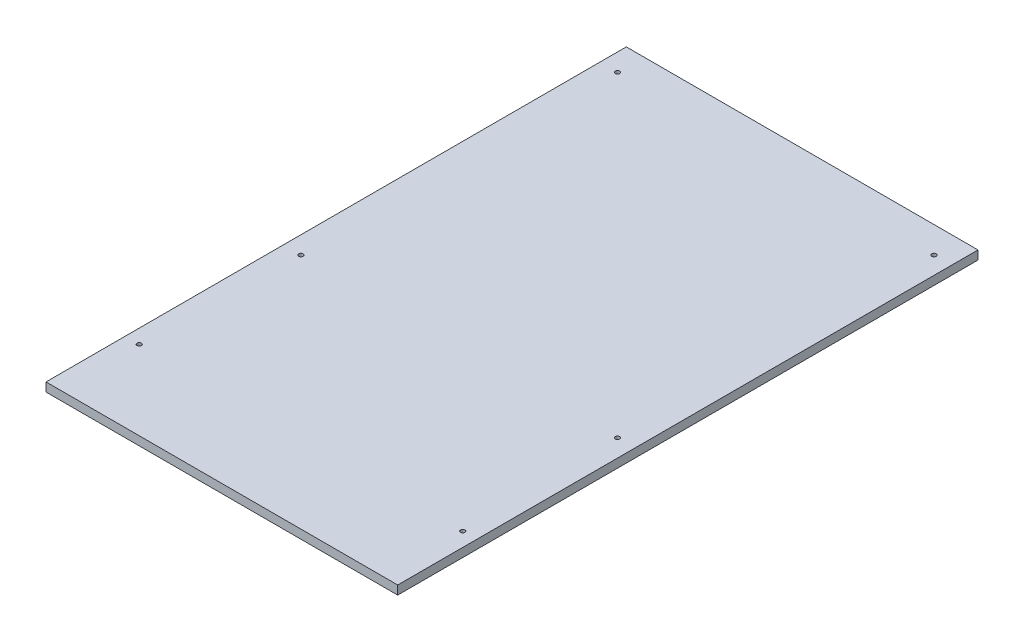
ISO-10303-21;
HEADER;
FILE_DESCRIPTION(('STEP AP214'),'2;1');
FILE_NAME('part.step','',(''),(''),'','','');
FILE_SCHEMA(('AUTOMOTIVE_DESIGN { 1 0 10303 214 1 1 1 1 }'));
ENDSEC;
DATA;
#1=APPLICATION_CONTEXT('core data for automotive mechanical design processes');
#2=APPLICATION_PROTOCOL_DEFINITION('international standard','automotive_design',2000,#1);
#3=PRODUCT_CONTEXT('',#1,'mechanical');
#4=PRODUCT('Part','Part','',(#3));
#5=PRODUCT_RELATED_PRODUCT_CATEGORY('part','',(#4));
#6=PRODUCT_DEFINITION_FORMATION('','',#4);
#7=PRODUCT_DEFINITION_CONTEXT('part definition',#1,'design');
#8=PRODUCT_DEFINITION('design','',#6,#7);
#9=PRODUCT_DEFINITION_SHAPE('','',#8);
#10=(LENGTH_UNIT() NAMED_UNIT(*) SI_UNIT(.MILLI.,.METRE.));
#11=(NAMED_UNIT(*) PLANE_ANGLE_UNIT() SI_UNIT($,.RADIAN.));
#12=(NAMED_UNIT(*) SI_UNIT($,.STERADIAN.) SOLID_ANGLE_UNIT());
#13=UNCERTAINTY_MEASURE_WITH_UNIT(LENGTH_MEASURE(1.E-05),#10,'distance_accuracy_value','');
#14=(GEOMETRIC_REPRESENTATION_CONTEXT(3) GLOBAL_UNCERTAINTY_ASSIGNED_CONTEXT((#13)) GLOBAL_UNIT_ASSIGNED_CONTEXT((#10,
#11,#12)) REPRESENTATION_CONTEXT('',''));
#15=CARTESIAN_POINT('',(0.,0.,0.));
#16=DIRECTION('',(0.,0.,1.));
#17=DIRECTION('',(1.,0.,0.));
#18=AXIS2_PLACEMENT_3D('',#15,#16,#17);
#19=CARTESIAN_POINT('',(-100.,5.,0.));
#20=DIRECTION('',(1.,0.,0.));
#21=DIRECTION('',(0.,0.,-1.));
#22=AXIS2_PLACEMENT_3D('',#19,#20,#21);
#23=PLANE('',#22);
#24=DIRECTION('',(0.,0.,1.));
#25=VECTOR('',#24,1.);
#26=CARTESIAN_POINT('',(-100.,0.,0.));
#27=LINE('',#26,#25);
#28=CARTESIAN_POINT('',(-100.,0.,-330.));
#29=VERTEX_POINT('',#28);
#30=CARTESIAN_POINT('',(-100.,0.,0.));
#31=VERTEX_POINT('',#30);
#32=EDGE_CURVE('E110',#29,#31,#27,.T.);
#33=ORIENTED_EDGE('',*,*,#32,.T.);
#34=DIRECTION('',(0.,-1.,0.));
#35=VECTOR('',#34,1.);
#36=CARTESIAN_POINT('',(-100.,5.,0.));
#37=LINE('',#36,#35);
#38=CARTESIAN_POINT('',(-100.,5.,0.));
#39=VERTEX_POINT('',#38);
#40=EDGE_CURVE('E11',#39,#31,#37,.T.);
#41=ORIENTED_EDGE('',*,*,#40,.F.);
#42=DIRECTION('',(0.,0.,1.));
#43=VECTOR('',#42,1.);
#44=CARTESIAN_POINT('',(-100.,5.,0.));
#45=LINE('',#44,#43);
#46=CARTESIAN_POINT('',(-100.,5.,-330.));
#47=VERTEX_POINT('',#46);
#48=EDGE_CURVE('E98',#47,#39,#45,.T.);
#49=ORIENTED_EDGE('',*,*,#48,.F.);
#50=DIRECTION('',(0.,-1.,0.));
#51=VECTOR('',#50,1.);
#52=CARTESIAN_POINT('',(-100.,5.,-330.));
#53=LINE('',#52,#51);
#54=EDGE_CURVE('E106',#47,#29,#53,.T.);
#55=ORIENTED_EDGE('',*,*,#54,.T.);
#56=EDGE_LOOP('',(#33,#41,#49,#55));
#57=FACE_BOUND('',#56,.T.);
#58=ADVANCED_FACE('F47',(#57),#23,.F.);
#59=CARTESIAN_POINT('',(-100.,5.,0.));
#60=DIRECTION('',(0.,0.,-1.));
#61=DIRECTION('',(-1.,0.,0.));
#62=AXIS2_PLACEMENT_3D('',#59,#60,#61);
#63=PLANE('',#62);
#64=DIRECTION('',(1.,0.,0.));
#65=VECTOR('',#64,1.);
#66=CARTESIAN_POINT('',(-100.,0.,0.));
#67=LINE('',#66,#65);
#68=CARTESIAN_POINT('',(100.,0.,0.));
#69=VERTEX_POINT('',#68);
#70=EDGE_CURVE('E102',#31,#69,#67,.T.);
#71=ORIENTED_EDGE('',*,*,#70,.T.);
#72=DIRECTION('',(0.,-1.,0.));
#73=VECTOR('',#72,1.);
#74=CARTESIAN_POINT('',(100.,5.,0.));
#75=LINE('',#74,#73);
#76=CARTESIAN_POINT('',(100.,5.,0.));
#77=VERTEX_POINT('',#76);
#78=EDGE_CURVE('E55',#77,#69,#75,.T.);
#79=ORIENTED_EDGE('',*,*,#78,.F.);
#80=DIRECTION('',(1.,0.,0.));
#81=VECTOR('',#80,1.);
#82=CARTESIAN_POINT('',(-100.,5.,0.));
#83=LINE('',#82,#81);
#84=EDGE_CURVE('E93',#39,#77,#83,.T.);
#85=ORIENTED_EDGE('',*,*,#84,.F.);
#86=ORIENTED_EDGE('',*,*,#40,.T.);
#87=EDGE_LOOP('',(#71,#79,#85,#86));
#88=FACE_BOUND('',#87,.T.);
#89=ADVANCED_FACE('F101',(#88),#63,.F.);
#90=CARTESIAN_POINT('',(100.,5.,0.));
#91=DIRECTION('',(-1.,0.,0.));
#92=DIRECTION('',(0.,0.,1.));
#93=AXIS2_PLACEMENT_3D('',#90,#91,#92);
#94=PLANE('',#93);
#95=DIRECTION('',(0.,0.,-1.));
#96=VECTOR('',#95,1.);
#97=CARTESIAN_POINT('',(100.,0.,0.));
#98=LINE('',#97,#96);
#99=CARTESIAN_POINT('',(100.,0.,-330.));
#100=VERTEX_POINT('',#99);
#101=EDGE_CURVE('E80',#69,#100,#98,.T.);
#102=ORIENTED_EDGE('',*,*,#101,.T.);
#103=DIRECTION('',(0.,-1.,0.));
#104=VECTOR('',#103,1.);
#105=CARTESIAN_POINT('',(100.,5.,-330.));
#106=LINE('',#105,#104);
#107=CARTESIAN_POINT('',(100.,5.,-330.));
#108=VERTEX_POINT('',#107);
#109=EDGE_CURVE('E103',#108,#100,#106,.T.);
#110=ORIENTED_EDGE('',*,*,#109,.F.);
#111=DIRECTION('',(0.,0.,-1.));
#112=VECTOR('',#111,1.);
#113=CARTESIAN_POINT('',(100.,5.,0.));
#114=LINE('',#113,#112);
#115=EDGE_CURVE('E96',#77,#108,#114,.T.);
#116=ORIENTED_EDGE('',*,*,#115,.F.);
#117=ORIENTED_EDGE('',*,*,#78,.T.);
#118=EDGE_LOOP('',(#102,#110,#116,#117));
#119=FACE_BOUND('',#118,.T.);
#120=ADVANCED_FACE('F104',(#119),#94,.F.);
#121=CARTESIAN_POINT('',(-100.,5.,-330.));
#122=DIRECTION('',(0.,0.,1.));
#123=DIRECTION('',(1.,0.,0.));
#124=AXIS2_PLACEMENT_3D('',#121,#122,#123);
#125=PLANE('',#124);
#126=DIRECTION('',(-1.,0.,0.));
#127=VECTOR('',#126,1.);
#128=CARTESIAN_POINT('',(-100.,0.,-330.));
#129=LINE('',#128,#127);
#130=EDGE_CURVE('E86',#100,#29,#129,.T.);
#131=ORIENTED_EDGE('',*,*,#130,.T.);
#132=ORIENTED_EDGE('',*,*,#54,.F.);
#133=DIRECTION('',(-1.,0.,0.));
#134=VECTOR('',#133,1.);
#135=CARTESIAN_POINT('',(-100.,5.,-330.));
#136=LINE('',#135,#134);
#137=EDGE_CURVE('E63',#108,#47,#136,.T.);
#138=ORIENTED_EDGE('',*,*,#137,.F.);
#139=ORIENTED_EDGE('',*,*,#109,.T.);
#140=EDGE_LOOP('',(#131,#132,#138,#139));
#141=FACE_BOUND('',#140,.T.);
#142=ADVANCED_FACE('F118',(#141),#125,.F.);
#143=CARTESIAN_POINT('',(0.,5.,0.));
#144=DIRECTION('',(0.,-1.,0.));
#145=DIRECTION('',(0.,0.,-1.));
#146=AXIS2_PLACEMENT_3D('',#143,#144,#145);
#147=PLANE('',#146);
#148=CARTESIAN_POINT('',(-92.,5.,-45.));
#149=DIRECTION('',(0.,1.,0.));
#150=DIRECTION('',(0.,0.,1.));
#151=AXIS2_PLACEMENT_3D('',#148,#149,#150);
#152=CIRCLE('',#151,1.25);
#153=CARTESIAN_POINT('',(-92.,5.,-43.75));
#154=VERTEX_POINT('',#153);
#155=EDGE_CURVE('E156',#154,#154,#152,.T.);
#156=ORIENTED_EDGE('',*,*,#155,.F.);
#157=EDGE_LOOP('',(#156));
#158=FACE_BOUND('',#157,.T.);
#159=CARTESIAN_POINT('',(92.,5.,-45.));
#160=DIRECTION('',(0.,1.,0.));
#161=DIRECTION('',(0.,0.,1.));
#162=AXIS2_PLACEMENT_3D('',#159,#160,#161);
#163=CIRCLE('',#162,1.25);
#164=CARTESIAN_POINT('',(92.,5.,-43.75));
#165=VERTEX_POINT('',#164);
#166=EDGE_CURVE('E150',#165,#165,#163,.T.);
#167=ORIENTED_EDGE('',*,*,#166,.F.);
#168=EDGE_LOOP('',(#167));
#169=FACE_BOUND('',#168,.T.);
#170=CARTESIAN_POINT('',(-90.,5.,-134.977775033616));
#171=DIRECTION('',(0.,1.,0.));
#172=DIRECTION('',(0.,0.,1.));
#173=AXIS2_PLACEMENT_3D('',#170,#171,#172);
#174=CIRCLE('',#173,1.25);
#175=CARTESIAN_POINT('',(-90.,5.,-133.727775033616));
#176=VERTEX_POINT('',#175);
#177=EDGE_CURVE('E144',#176,#176,#174,.T.);
#178=ORIENTED_EDGE('',*,*,#177,.F.);
#179=EDGE_LOOP('',(#178));
#180=FACE_BOUND('',#179,.T.);
#181=CARTESIAN_POINT('',(90.,5.,-134.977775033616));
#182=DIRECTION('',(0.,1.,0.));
#183=DIRECTION('',(0.,0.,1.));
#184=AXIS2_PLACEMENT_3D('',#181,#182,#183);
#185=CIRCLE('',#184,1.25);
#186=CARTESIAN_POINT('',(90.,5.,-133.727775033616));
#187=VERTEX_POINT('',#186);
#188=EDGE_CURVE('E138',#187,#187,#185,.T.);
#189=ORIENTED_EDGE('',*,*,#188,.F.);
#190=EDGE_LOOP('',(#189));
#191=FACE_BOUND('',#190,.T.);
#192=CARTESIAN_POINT('',(-90.,5.,-314.977775033616));
#193=DIRECTION('',(0.,1.,0.));
#194=DIRECTION('',(0.,0.,1.));
#195=AXIS2_PLACEMENT_3D('',#192,#193,#194);
#196=CIRCLE('',#195,1.25);
#197=CARTESIAN_POINT('',(-90.,5.,-313.727775033616));
#198=VERTEX_POINT('',#197);
#199=EDGE_CURVE('E132',#198,#198,#196,.T.);
#200=ORIENTED_EDGE('',*,*,#199,.F.);
#201=EDGE_LOOP('',(#200));
#202=FACE_BOUND('',#201,.T.);
#203=CARTESIAN_POINT('',(90.,5.,-314.977775033616));
#204=DIRECTION('',(0.,1.,0.));
#205=DIRECTION('',(0.,0.,1.));
#206=AXIS2_PLACEMENT_3D('',#203,#204,#205);
#207=CIRCLE('',#206,1.25);
#208=CARTESIAN_POINT('',(90.,5.,-313.727775033616));
#209=VERTEX_POINT('',#208);
#210=EDGE_CURVE('E126',#209,#209,#207,.T.);
#211=ORIENTED_EDGE('',*,*,#210,.F.);
#212=EDGE_LOOP('',(#211));
#213=FACE_BOUND('',#212,.T.);
#214=ORIENTED_EDGE('',*,*,#48,.T.);
#215=ORIENTED_EDGE('',*,*,#84,.T.);
#216=ORIENTED_EDGE('',*,*,#115,.T.);
#217=ORIENTED_EDGE('',*,*,#137,.T.);
#218=EDGE_LOOP('',(#214,#215,#216,#217));
#219=FACE_BOUND('',#218,.T.);
#220=ADVANCED_FACE('F94',(#158,#169,#180,#191,#202,#213,#219),#147,.F.);
#221=CARTESIAN_POINT('',(0.,0.,0.));
#222=DIRECTION('',(0.,-1.,0.));
#223=DIRECTION('',(0.,0.,-1.));
#224=AXIS2_PLACEMENT_3D('',#221,#222,#223);
#225=PLANE('',#224);
#226=CARTESIAN_POINT('',(-92.,0.,-45.));
#227=DIRECTION('',(0.,1.,0.));
#228=DIRECTION('',(0.,0.,1.));
#229=AXIS2_PLACEMENT_3D('',#226,#227,#228);
#230=CIRCLE('',#229,1.25);
#231=CARTESIAN_POINT('',(-92.,0.,-43.75));
#232=VERTEX_POINT('',#231);
#233=EDGE_CURVE('E153',#232,#232,#230,.T.);
#234=ORIENTED_EDGE('',*,*,#233,.T.);
#235=EDGE_LOOP('',(#234));
#236=FACE_BOUND('',#235,.T.);
#237=CARTESIAN_POINT('',(92.,0.,-45.));
#238=DIRECTION('',(0.,1.,0.));
#239=DIRECTION('',(0.,0.,1.));
#240=AXIS2_PLACEMENT_3D('',#237,#238,#239);
#241=CIRCLE('',#240,1.25);
#242=CARTESIAN_POINT('',(92.,0.,-43.75));
#243=VERTEX_POINT('',#242);
#244=EDGE_CURVE('E147',#243,#243,#241,.T.);
#245=ORIENTED_EDGE('',*,*,#244,.T.);
#246=EDGE_LOOP('',(#245));
#247=FACE_BOUND('',#246,.T.);
#248=CARTESIAN_POINT('',(-90.,0.,-134.977775033616));
#249=DIRECTION('',(0.,1.,0.));
#250=DIRECTION('',(0.,0.,1.));
#251=AXIS2_PLACEMENT_3D('',#248,#249,#250);
#252=CIRCLE('',#251,1.25);
#253=CARTESIAN_POINT('',(-90.,0.,-133.727775033616));
#254=VERTEX_POINT('',#253);
#255=EDGE_CURVE('E141',#254,#254,#252,.T.);
#256=ORIENTED_EDGE('',*,*,#255,.T.);
#257=EDGE_LOOP('',(#256));
#258=FACE_BOUND('',#257,.T.);
#259=CARTESIAN_POINT('',(90.,0.,-134.977775033616));
#260=DIRECTION('',(0.,1.,0.));
#261=DIRECTION('',(0.,0.,1.));
#262=AXIS2_PLACEMENT_3D('',#259,#260,#261);
#263=CIRCLE('',#262,1.25);
#264=CARTESIAN_POINT('',(90.,0.,-133.727775033616));
#265=VERTEX_POINT('',#264);
#266=EDGE_CURVE('E135',#265,#265,#263,.T.);
#267=ORIENTED_EDGE('',*,*,#266,.T.);
#268=EDGE_LOOP('',(#267));
#269=FACE_BOUND('',#268,.T.);
#270=CARTESIAN_POINT('',(-90.,0.,-314.977775033616));
#271=DIRECTION('',(0.,1.,0.));
#272=DIRECTION('',(0.,0.,1.));
#273=AXIS2_PLACEMENT_3D('',#270,#271,#272);
#274=CIRCLE('',#273,1.25);
#275=CARTESIAN_POINT('',(-90.,0.,-313.727775033616));
#276=VERTEX_POINT('',#275);
#277=EDGE_CURVE('E129',#276,#276,#274,.T.);
#278=ORIENTED_EDGE('',*,*,#277,.T.);
#279=EDGE_LOOP('',(#278));
#280=FACE_BOUND('',#279,.T.);
#281=CARTESIAN_POINT('',(90.,0.,-314.977775033616));
#282=DIRECTION('',(0.,1.,0.));
#283=DIRECTION('',(0.,0.,1.));
#284=AXIS2_PLACEMENT_3D('',#281,#282,#283);
#285=CIRCLE('',#284,1.25);
#286=CARTESIAN_POINT('',(90.,0.,-313.727775033616));
#287=VERTEX_POINT('',#286);
#288=EDGE_CURVE('E113',#287,#287,#285,.T.);
#289=ORIENTED_EDGE('',*,*,#288,.T.);
#290=EDGE_LOOP('',(#289));
#291=FACE_BOUND('',#290,.T.);
#292=ORIENTED_EDGE('',*,*,#32,.F.);
#293=ORIENTED_EDGE('',*,*,#130,.F.);
#294=ORIENTED_EDGE('',*,*,#101,.F.);
#295=ORIENTED_EDGE('',*,*,#70,.F.);
#296=EDGE_LOOP('',(#292,#293,#294,#295));
#297=FACE_BOUND('',#296,.T.);
#298=ADVANCED_FACE('F121',(#236,#247,#258,#269,#280,#291,#297),#225,.T.);
#299=CARTESIAN_POINT('',(90.,5.,-314.977775033616));
#300=DIRECTION('',(0.,1.,0.));
#301=DIRECTION('',(0.,0.,1.));
#302=AXIS2_PLACEMENT_3D('',#299,#300,#301);
#303=CYLINDRICAL_SURFACE('',#302,1.25);
#304=ORIENTED_EDGE('',*,*,#288,.F.);
#305=EDGE_LOOP('',(#304));
#306=FACE_BOUND('',#305,.T.);
#307=ORIENTED_EDGE('',*,*,#210,.T.);
#308=EDGE_LOOP('',(#307));
#309=FACE_BOUND('',#308,.T.);
#310=ADVANCED_FACE('F175',(#306,#309),#303,.F.);
#311=CARTESIAN_POINT('',(-90.,5.,-314.977775033616));
#312=DIRECTION('',(0.,1.,0.));
#313=DIRECTION('',(0.,0.,1.));
#314=AXIS2_PLACEMENT_3D('',#311,#312,#313);
#315=CYLINDRICAL_SURFACE('',#314,1.25);
#316=ORIENTED_EDGE('',*,*,#277,.F.);
#317=EDGE_LOOP('',(#316));
#318=FACE_BOUND('',#317,.T.);
#319=ORIENTED_EDGE('',*,*,#199,.T.);
#320=EDGE_LOOP('',(#319));
#321=FACE_BOUND('',#320,.T.);
#322=ADVANCED_FACE('F177',(#318,#321),#315,.F.);
#323=CARTESIAN_POINT('',(90.,5.,-134.977775033616));
#324=DIRECTION('',(0.,1.,0.));
#325=DIRECTION('',(0.,0.,1.));
#326=AXIS2_PLACEMENT_3D('',#323,#324,#325);
#327=CYLINDRICAL_SURFACE('',#326,1.25);
#328=ORIENTED_EDGE('',*,*,#266,.F.);
#329=EDGE_LOOP('',(#328));
#330=FACE_BOUND('',#329,.T.);
#331=ORIENTED_EDGE('',*,*,#188,.T.);
#332=EDGE_LOOP('',(#331));
#333=FACE_BOUND('',#332,.T.);
#334=ADVANCED_FACE('F183',(#330,#333),#327,.F.);
#335=CARTESIAN_POINT('',(-90.,5.,-134.977775033616));
#336=DIRECTION('',(0.,1.,0.));
#337=DIRECTION('',(0.,0.,1.));
#338=AXIS2_PLACEMENT_3D('',#335,#336,#337);
#339=CYLINDRICAL_SURFACE('',#338,1.25);
#340=ORIENTED_EDGE('',*,*,#255,.F.);
#341=EDGE_LOOP('',(#340));
#342=FACE_BOUND('',#341,.T.);
#343=ORIENTED_EDGE('',*,*,#177,.T.);
#344=EDGE_LOOP('',(#343));
#345=FACE_BOUND('',#344,.T.);
#346=ADVANCED_FACE('F245',(#342,#345),#339,.F.);
#347=CARTESIAN_POINT('',(92.,5.,-45.));
#348=DIRECTION('',(0.,1.,0.));
#349=DIRECTION('',(0.,0.,1.));
#350=AXIS2_PLACEMENT_3D('',#347,#348,#349);
#351=CYLINDRICAL_SURFACE('',#350,1.25);
#352=ORIENTED_EDGE('',*,*,#244,.F.);
#353=EDGE_LOOP('',(#352));
#354=FACE_BOUND('',#353,.T.);
#355=ORIENTED_EDGE('',*,*,#166,.T.);
#356=EDGE_LOOP('',(#355));
#357=FACE_BOUND('',#356,.T.);
#358=ADVANCED_FACE('F258',(#354,#357),#351,.F.);
#359=CARTESIAN_POINT('',(-92.,5.,-45.));
#360=DIRECTION('',(0.,1.,0.));
#361=DIRECTION('',(0.,0.,1.));
#362=AXIS2_PLACEMENT_3D('',#359,#360,#361);
#363=CYLINDRICAL_SURFACE('',#362,1.25);
#364=ORIENTED_EDGE('',*,*,#233,.F.);
#365=EDGE_LOOP('',(#364));
#366=FACE_BOUND('',#365,.T.);
#367=ORIENTED_EDGE('',*,*,#155,.T.);
#368=EDGE_LOOP('',(#367));
#369=FACE_BOUND('',#368,.T.);
#370=ADVANCED_FACE('F160',(#366,#369),#363,.F.);
#371=CLOSED_SHELL('',(#58,#89,#120,#142,#220,#298,#310,#322,#334,#346,#358,#370));
#372=MANIFOLD_SOLID_BREP('B2',#371);
#373=ADVANCED_BREP_SHAPE_REPRESENTATION('',(#18,#372),#14);
#374=SHAPE_DEFINITION_REPRESENTATION(#9,#373);
ENDSEC;
END-ISO-10303-21;
